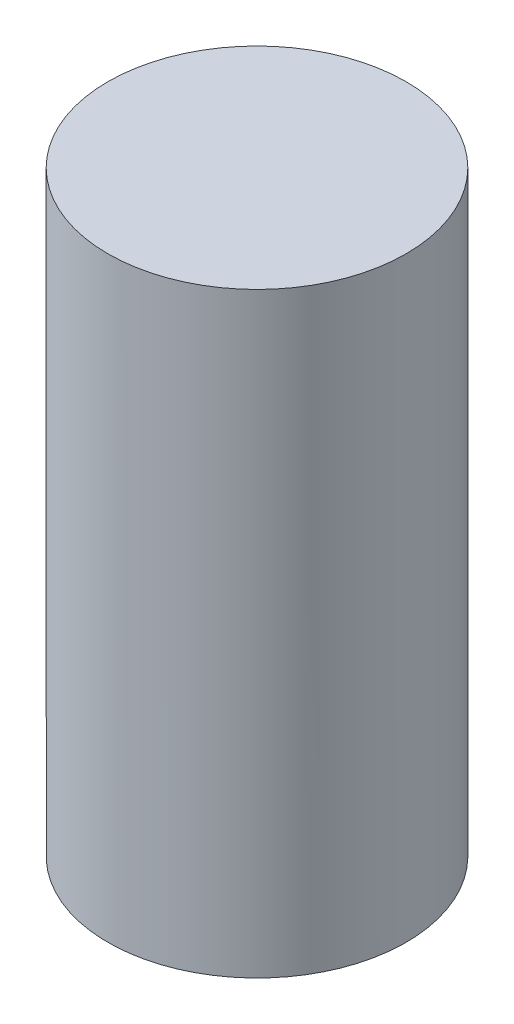
ISO-10303-21;
HEADER;
FILE_DESCRIPTION(('STEP AP214'),'2;1');
FILE_NAME('part.step','',(''),(''),'','','');
FILE_SCHEMA(('AUTOMOTIVE_DESIGN { 1 0 10303 214 1 1 1 1 }'));
ENDSEC;
DATA;
#1=APPLICATION_CONTEXT('core data for automotive mechanical design processes');
#2=APPLICATION_PROTOCOL_DEFINITION('international standard','automotive_design',2000,#1);
#3=PRODUCT_CONTEXT('',#1,'mechanical');
#4=PRODUCT('Part','Part','',(#3));
#5=PRODUCT_RELATED_PRODUCT_CATEGORY('part','',(#4));
#6=PRODUCT_DEFINITION_FORMATION('','',#4);
#7=PRODUCT_DEFINITION_CONTEXT('part definition',#1,'design');
#8=PRODUCT_DEFINITION('design','',#6,#7);
#9=PRODUCT_DEFINITION_SHAPE('','',#8);
#10=(LENGTH_UNIT() NAMED_UNIT(*) SI_UNIT(.MILLI.,.METRE.));
#11=(NAMED_UNIT(*) PLANE_ANGLE_UNIT() SI_UNIT($,.RADIAN.));
#12=(NAMED_UNIT(*) SI_UNIT($,.STERADIAN.) SOLID_ANGLE_UNIT());
#13=UNCERTAINTY_MEASURE_WITH_UNIT(LENGTH_MEASURE(1.E-05),#10,'distance_accuracy_value','');
#14=(GEOMETRIC_REPRESENTATION_CONTEXT(3) GLOBAL_UNCERTAINTY_ASSIGNED_CONTEXT((#13)) GLOBAL_UNIT_ASSIGNED_CONTEXT((#10,
#11,#12)) REPRESENTATION_CONTEXT('',''));
#15=CARTESIAN_POINT('',(0.,0.,0.));
#16=DIRECTION('',(0.,0.,1.));
#17=DIRECTION('',(1.,0.,0.));
#18=AXIS2_PLACEMENT_3D('',#15,#16,#17);
#19=CARTESIAN_POINT('',(0.,15.,0.));
#20=DIRECTION('',(0.,-1.,0.));
#21=DIRECTION('',(0.,0.,-1.));
#22=AXIS2_PLACEMENT_3D('',#19,#20,#21);
#23=CYLINDRICAL_SURFACE('',#22,5.);
#24=CARTESIAN_POINT('',(0.,-2.,0.));
#25=DIRECTION('',(0.,-1.,0.));
#26=DIRECTION('',(0.,0.,-1.));
#27=AXIS2_PLACEMENT_3D('',#24,#25,#26);
#28=CIRCLE('',#27,5.);
#29=CARTESIAN_POINT('',(0.,-2.,-5.));
#30=VERTEX_POINT('',#29);
#31=EDGE_CURVE('E195',#30,#30,#28,.T.);
#32=ORIENTED_EDGE('',*,*,#31,.F.);
#33=EDGE_LOOP('',(#32));
#34=FACE_BOUND('',#33,.T.);
#35=CARTESIAN_POINT('',(0.,18.,0.));
#36=DIRECTION('',(0.,1.,0.));
#37=DIRECTION('',(0.,0.,1.));
#38=AXIS2_PLACEMENT_3D('',#35,#36,#37);
#39=CIRCLE('',#38,5.);
#40=CARTESIAN_POINT('',(0.,18.,5.));
#41=VERTEX_POINT('',#40);
#42=EDGE_CURVE('E198',#41,#41,#39,.T.);
#43=ORIENTED_EDGE('',*,*,#42,.F.);
#44=EDGE_LOOP('',(#43));
#45=FACE_BOUND('',#44,.T.);
#46=ADVANCED_FACE('F44',(#34,#45),#23,.T.);
#47=CARTESIAN_POINT('',(2.,15.,-2.23606797749979));
#48=DIRECTION('',(0.,-1.,0.));
#49=DIRECTION('',(0.,0.,-1.));
#50=AXIS2_PLACEMENT_3D('',#47,#48,#49);
#51=CYLINDRICAL_SURFACE('',#50,0.5);
#52=CARTESIAN_POINT('',(2.,0.,-2.23606797749979));
#53=DIRECTION('',(0.,1.,0.));
#54=DIRECTION('',(0.,0.,1.));
#55=AXIS2_PLACEMENT_3D('',#52,#53,#54);
#56=CIRCLE('',#55,0.5);
#57=CARTESIAN_POINT('',(2.33333333333333,0.,-2.60874597374976));
#58=VERTEX_POINT('',#57);
#59=CARTESIAN_POINT('',(1.5,0.,-2.23606797749979));
#60=VERTEX_POINT('',#59);
#61=EDGE_CURVE('E129',#58,#60,#56,.T.);
#62=ORIENTED_EDGE('',*,*,#61,.F.);
#63=DIRECTION('',(0.,-1.,0.));
#64=VECTOR('',#63,1.);
#65=CARTESIAN_POINT('',(2.33333333333333,15.,-2.60874597374976));
#66=LINE('',#65,#64);
#67=CARTESIAN_POINT('',(2.33333333333333,15.,-2.60874597374976));
#68=VERTEX_POINT('',#67);
#69=EDGE_CURVE('E146',#68,#58,#66,.T.);
#70=ORIENTED_EDGE('',*,*,#69,.F.);
#71=CARTESIAN_POINT('',(2.,15.,-2.23606797749979));
#72=DIRECTION('',(0.,1.,0.));
#73=DIRECTION('',(0.,0.,1.));
#74=AXIS2_PLACEMENT_3D('',#71,#72,#73);
#75=CIRCLE('',#74,0.5);
#76=CARTESIAN_POINT('',(1.5,15.,-2.23606797749979));
#77=VERTEX_POINT('',#76);
#78=EDGE_CURVE('E135',#68,#77,#75,.T.);
#79=ORIENTED_EDGE('',*,*,#78,.T.);
#80=DIRECTION('',(0.,-1.,0.));
#81=VECTOR('',#80,1.);
#82=CARTESIAN_POINT('',(1.5,15.,-2.23606797749979));
#83=LINE('',#82,#81);
#84=EDGE_CURVE('E11',#77,#60,#83,.T.);
#85=ORIENTED_EDGE('',*,*,#84,.T.);
#86=EDGE_LOOP('',(#62,#70,#79,#85));
#87=FACE_BOUND('',#86,.T.);
#88=ADVANCED_FACE('F172',(#87),#51,.F.);
#89=CARTESIAN_POINT('',(1.5,15.,2.23606797749979));
#90=DIRECTION('',(1.,0.,0.));
#91=DIRECTION('',(0.,0.,-1.));
#92=AXIS2_PLACEMENT_3D('',#89,#90,#91);
#93=PLANE('',#92);
#94=DIRECTION('',(0.,0.,1.));
#95=VECTOR('',#94,1.);
#96=CARTESIAN_POINT('',(1.5,0.,2.23606797749979));
#97=LINE('',#96,#95);
#98=CARTESIAN_POINT('',(1.5,0.,2.23606797749979));
#99=VERTEX_POINT('',#98);
#100=EDGE_CURVE('E149',#60,#99,#97,.T.);
#101=ORIENTED_EDGE('',*,*,#100,.F.);
#102=ORIENTED_EDGE('',*,*,#84,.F.);
#103=DIRECTION('',(0.,0.,1.));
#104=VECTOR('',#103,1.);
#105=CARTESIAN_POINT('',(1.5,15.,2.23606797749979));
#106=LINE('',#105,#104);
#107=CARTESIAN_POINT('',(1.5,15.,2.23606797749979));
#108=VERTEX_POINT('',#107);
#109=EDGE_CURVE('E138',#77,#108,#106,.T.);
#110=ORIENTED_EDGE('',*,*,#109,.T.);
#111=DIRECTION('',(0.,-1.,0.));
#112=VECTOR('',#111,1.);
#113=CARTESIAN_POINT('',(1.5,15.,2.23606797749979));
#114=LINE('',#113,#112);
#115=EDGE_CURVE('E51',#108,#99,#114,.T.);
#116=ORIENTED_EDGE('',*,*,#115,.T.);
#117=EDGE_LOOP('',(#101,#102,#110,#116));
#118=FACE_BOUND('',#117,.T.);
#119=ADVANCED_FACE('F162',(#118),#93,.T.);
#120=CARTESIAN_POINT('',(2.,15.,2.23606797749979));
#121=DIRECTION('',(0.,-1.,0.));
#122=DIRECTION('',(0.,0.,-1.));
#123=AXIS2_PLACEMENT_3D('',#120,#121,#122);
#124=CYLINDRICAL_SURFACE('',#123,0.5);
#125=CARTESIAN_POINT('',(2.,0.,2.23606797749979));
#126=DIRECTION('',(0.,1.,0.));
#127=DIRECTION('',(0.,0.,-1.));
#128=AXIS2_PLACEMENT_3D('',#125,#126,#127);
#129=CIRCLE('',#128,0.5);
#130=CARTESIAN_POINT('',(2.33333333333333,0.,2.60874597374976));
#131=VERTEX_POINT('',#130);
#132=EDGE_CURVE('E152',#99,#131,#129,.T.);
#133=ORIENTED_EDGE('',*,*,#132,.F.);
#134=ORIENTED_EDGE('',*,*,#115,.F.);
#135=CARTESIAN_POINT('',(2.,15.,2.23606797749979));
#136=DIRECTION('',(0.,1.,0.));
#137=DIRECTION('',(0.,0.,-1.));
#138=AXIS2_PLACEMENT_3D('',#135,#136,#137);
#139=CIRCLE('',#138,0.5);
#140=CARTESIAN_POINT('',(2.33333333333333,15.,2.60874597374976));
#141=VERTEX_POINT('',#140);
#142=EDGE_CURVE('E142',#108,#141,#139,.T.);
#143=ORIENTED_EDGE('',*,*,#142,.T.);
#144=DIRECTION('',(0.,-1.,0.));
#145=VECTOR('',#144,1.);
#146=CARTESIAN_POINT('',(2.33333333333333,15.,2.60874597374976));
#147=LINE('',#146,#145);
#148=EDGE_CURVE('E158',#141,#131,#147,.T.);
#149=ORIENTED_EDGE('',*,*,#148,.T.);
#150=EDGE_LOOP('',(#133,#134,#143,#149));
#151=FACE_BOUND('',#150,.T.);
#152=ADVANCED_FACE('F165',(#151),#124,.F.);
#153=CARTESIAN_POINT('',(0.,15.,0.));
#154=DIRECTION('',(0.,-1.,0.));
#155=DIRECTION('',(0.,0.,-1.));
#156=AXIS2_PLACEMENT_3D('',#153,#154,#155);
#157=CYLINDRICAL_SURFACE('',#156,3.5);
#158=CARTESIAN_POINT('',(0.,0.,0.));
#159=DIRECTION('',(0.,1.,0.));
#160=DIRECTION('',(0.,0.,1.));
#161=AXIS2_PLACEMENT_3D('',#158,#159,#160);
#162=CIRCLE('',#161,3.5);
#163=EDGE_CURVE('E139',#131,#58,#162,.T.);
#164=ORIENTED_EDGE('',*,*,#163,.F.);
#165=ORIENTED_EDGE('',*,*,#148,.F.);
#166=CARTESIAN_POINT('',(0.,15.,0.));
#167=DIRECTION('',(0.,1.,0.));
#168=DIRECTION('',(0.,0.,1.));
#169=AXIS2_PLACEMENT_3D('',#166,#167,#168);
#170=CIRCLE('',#169,3.5);
#171=EDGE_CURVE('E66',#141,#68,#170,.T.);
#172=ORIENTED_EDGE('',*,*,#171,.T.);
#173=ORIENTED_EDGE('',*,*,#69,.T.);
#174=EDGE_LOOP('',(#164,#165,#172,#173));
#175=FACE_BOUND('',#174,.T.);
#176=ADVANCED_FACE('F175',(#175),#157,.F.);
#177=CARTESIAN_POINT('',(-2.,15.,2.23606797749979));
#178=DIRECTION('',(0.,-1.,0.));
#179=DIRECTION('',(0.,0.,-1.));
#180=AXIS2_PLACEMENT_3D('',#177,#178,#179);
#181=CYLINDRICAL_SURFACE('',#180,0.5);
#182=CARTESIAN_POINT('',(-2.,0.,2.23606797749979));
#183=DIRECTION('',(0.,1.,0.));
#184=DIRECTION('',(0.,0.,-1.));
#185=AXIS2_PLACEMENT_3D('',#182,#183,#184);
#186=CIRCLE('',#185,0.5);
#187=CARTESIAN_POINT('',(-2.33333333333333,0.,2.60874597374976));
#188=VERTEX_POINT('',#187);
#189=CARTESIAN_POINT('',(-1.5,0.,2.23606797749979));
#190=VERTEX_POINT('',#189);
#191=EDGE_CURVE('E215',#188,#190,#186,.T.);
#192=ORIENTED_EDGE('',*,*,#191,.F.);
#193=DIRECTION('',(0.,-1.,0.));
#194=VECTOR('',#193,1.);
#195=CARTESIAN_POINT('',(-2.33333333333333,15.,2.60874597374976));
#196=LINE('',#195,#194);
#197=CARTESIAN_POINT('',(-2.33333333333333,15.,2.60874597374976));
#198=VERTEX_POINT('',#197);
#199=EDGE_CURVE('E131',#198,#188,#196,.T.);
#200=ORIENTED_EDGE('',*,*,#199,.F.);
#201=CARTESIAN_POINT('',(-2.,15.,2.23606797749979));
#202=DIRECTION('',(0.,1.,0.));
#203=DIRECTION('',(0.,0.,-1.));
#204=AXIS2_PLACEMENT_3D('',#201,#202,#203);
#205=CIRCLE('',#204,0.5);
#206=CARTESIAN_POINT('',(-1.5,15.,2.23606797749979));
#207=VERTEX_POINT('',#206);
#208=EDGE_CURVE('E121',#198,#207,#205,.T.);
#209=ORIENTED_EDGE('',*,*,#208,.T.);
#210=DIRECTION('',(0.,-1.,0.));
#211=VECTOR('',#210,1.);
#212=CARTESIAN_POINT('',(-1.5,15.,2.23606797749979));
#213=LINE('',#212,#211);
#214=EDGE_CURVE('E120',#207,#190,#213,.T.);
#215=ORIENTED_EDGE('',*,*,#214,.T.);
#216=EDGE_LOOP('',(#192,#200,#209,#215));
#217=FACE_BOUND('',#216,.T.);
#218=ADVANCED_FACE('F177',(#217),#181,.F.);
#219=CARTESIAN_POINT('',(-1.5,15.,2.23606797749979));
#220=DIRECTION('',(-1.,0.,0.));
#221=DIRECTION('',(0.,0.,1.));
#222=AXIS2_PLACEMENT_3D('',#219,#220,#221);
#223=PLANE('',#222);
#224=DIRECTION('',(0.,0.,-1.));
#225=VECTOR('',#224,1.);
#226=CARTESIAN_POINT('',(-1.5,0.,2.23606797749979));
#227=LINE('',#226,#225);
#228=CARTESIAN_POINT('',(-1.5,0.,-2.23606797749979));
#229=VERTEX_POINT('',#228);
#230=EDGE_CURVE('E221',#190,#229,#227,.T.);
#231=ORIENTED_EDGE('',*,*,#230,.F.);
#232=ORIENTED_EDGE('',*,*,#214,.F.);
#233=DIRECTION('',(0.,0.,-1.));
#234=VECTOR('',#233,1.);
#235=CARTESIAN_POINT('',(-1.5,15.,2.23606797749979));
#236=LINE('',#235,#234);
#237=CARTESIAN_POINT('',(-1.5,15.,-2.23606797749979));
#238=VERTEX_POINT('',#237);
#239=EDGE_CURVE('E109',#207,#238,#236,.T.);
#240=ORIENTED_EDGE('',*,*,#239,.T.);
#241=DIRECTION('',(0.,-1.,0.));
#242=VECTOR('',#241,1.);
#243=CARTESIAN_POINT('',(-1.5,15.,-2.23606797749979));
#244=LINE('',#243,#242);
#245=EDGE_CURVE('E117',#238,#229,#244,.T.);
#246=ORIENTED_EDGE('',*,*,#245,.T.);
#247=EDGE_LOOP('',(#231,#232,#240,#246));
#248=FACE_BOUND('',#247,.T.);
#249=ADVANCED_FACE('F116',(#248),#223,.T.);
#250=CARTESIAN_POINT('',(-2.,15.,-2.23606797749979));
#251=DIRECTION('',(0.,-1.,0.));
#252=DIRECTION('',(0.,0.,-1.));
#253=AXIS2_PLACEMENT_3D('',#250,#251,#252);
#254=CYLINDRICAL_SURFACE('',#253,0.5);
#255=CARTESIAN_POINT('',(-2.,0.,-2.23606797749979));
#256=DIRECTION('',(0.,1.,0.));
#257=DIRECTION('',(0.,0.,1.));
#258=AXIS2_PLACEMENT_3D('',#255,#256,#257);
#259=CIRCLE('',#258,0.5);
#260=CARTESIAN_POINT('',(-2.33333333333333,0.,-2.60874597374976));
#261=VERTEX_POINT('',#260);
#262=EDGE_CURVE('E125',#229,#261,#259,.T.);
#263=ORIENTED_EDGE('',*,*,#262,.F.);
#264=ORIENTED_EDGE('',*,*,#245,.F.);
#265=CARTESIAN_POINT('',(-2.,15.,-2.23606797749979));
#266=DIRECTION('',(0.,1.,0.));
#267=DIRECTION('',(0.,0.,1.));
#268=AXIS2_PLACEMENT_3D('',#265,#266,#267);
#269=CIRCLE('',#268,0.5);
#270=CARTESIAN_POINT('',(-2.33333333333333,15.,-2.60874597374976));
#271=VERTEX_POINT('',#270);
#272=EDGE_CURVE('E106',#238,#271,#269,.T.);
#273=ORIENTED_EDGE('',*,*,#272,.T.);
#274=DIRECTION('',(0.,-1.,0.));
#275=VECTOR('',#274,1.);
#276=CARTESIAN_POINT('',(-2.33333333333333,15.,-2.60874597374976));
#277=LINE('',#276,#275);
#278=EDGE_CURVE('E127',#271,#261,#277,.T.);
#279=ORIENTED_EDGE('',*,*,#278,.T.);
#280=EDGE_LOOP('',(#263,#264,#273,#279));
#281=FACE_BOUND('',#280,.T.);
#282=ADVANCED_FACE('F123',(#281),#254,.F.);
#283=CARTESIAN_POINT('',(0.,15.,0.));
#284=DIRECTION('',(0.,-1.,0.));
#285=DIRECTION('',(0.,0.,-1.));
#286=AXIS2_PLACEMENT_3D('',#283,#284,#285);
#287=CYLINDRICAL_SURFACE('',#286,3.5);
#288=CARTESIAN_POINT('',(0.,0.,0.));
#289=DIRECTION('',(0.,1.,0.));
#290=DIRECTION('',(0.,0.,1.));
#291=AXIS2_PLACEMENT_3D('',#288,#289,#290);
#292=CIRCLE('',#291,3.5);
#293=EDGE_CURVE('E216',#261,#188,#292,.T.);
#294=ORIENTED_EDGE('',*,*,#293,.F.);
#295=ORIENTED_EDGE('',*,*,#278,.F.);
#296=CARTESIAN_POINT('',(0.,15.,0.));
#297=DIRECTION('',(0.,1.,0.));
#298=DIRECTION('',(0.,0.,1.));
#299=AXIS2_PLACEMENT_3D('',#296,#297,#298);
#300=CIRCLE('',#299,3.5);
#301=EDGE_CURVE('E58',#271,#198,#300,.T.);
#302=ORIENTED_EDGE('',*,*,#301,.T.);
#303=ORIENTED_EDGE('',*,*,#199,.T.);
#304=EDGE_LOOP('',(#294,#295,#302,#303));
#305=FACE_BOUND('',#304,.T.);
#306=ADVANCED_FACE('F229',(#305),#287,.F.);
#307=CARTESIAN_POINT('',(0.,0.,0.));
#308=DIRECTION('',(0.,-1.,0.));
#309=DIRECTION('',(0.,0.,-1.));
#310=AXIS2_PLACEMENT_3D('',#307,#308,#309);
#311=PLANE('',#310);
#312=CARTESIAN_POINT('',(2.5,0.,0.));
#313=DIRECTION('',(0.,-1.,0.));
#314=DIRECTION('',(0.,0.,1.));
#315=AXIS2_PLACEMENT_3D('',#312,#313,#314);
#316=CIRCLE('',#315,0.8);
#317=CARTESIAN_POINT('',(2.5,0.,0.8));
#318=VERTEX_POINT('',#317);
#319=EDGE_CURVE('E200',#318,#318,#316,.T.);
#320=ORIENTED_EDGE('',*,*,#319,.T.);
#321=EDGE_LOOP('',(#320));
#322=FACE_BOUND('',#321,.T.);
#323=ORIENTED_EDGE('',*,*,#163,.T.);
#324=ORIENTED_EDGE('',*,*,#61,.T.);
#325=ORIENTED_EDGE('',*,*,#100,.T.);
#326=ORIENTED_EDGE('',*,*,#132,.T.);
#327=EDGE_LOOP('',(#323,#324,#325,#326));
#328=FACE_BOUND('',#327,.T.);
#329=ADVANCED_FACE('F168',(#322,#328),#311,.F.);
#330=CARTESIAN_POINT('',(-2.5,0.,0.));
#331=DIRECTION('',(0.,-1.,0.));
#332=DIRECTION('',(0.,0.,-1.));
#333=AXIS2_PLACEMENT_3D('',#330,#331,#332);
#334=CIRCLE('',#333,0.8);
#335=CARTESIAN_POINT('',(-2.5,0.,-0.8));
#336=VERTEX_POINT('',#335);
#337=EDGE_CURVE('E207',#336,#336,#334,.T.);
#338=ORIENTED_EDGE('',*,*,#337,.T.);
#339=EDGE_LOOP('',(#338));
#340=FACE_BOUND('',#339,.T.);
#341=ORIENTED_EDGE('',*,*,#293,.T.);
#342=ORIENTED_EDGE('',*,*,#191,.T.);
#343=ORIENTED_EDGE('',*,*,#230,.T.);
#344=ORIENTED_EDGE('',*,*,#262,.T.);
#345=EDGE_LOOP('',(#341,#342,#343,#344));
#346=FACE_BOUND('',#345,.T.);
#347=ADVANCED_FACE('F231',(#340,#346),#311,.F.);
#348=CARTESIAN_POINT('',(0.,-2.,0.));
#349=DIRECTION('',(0.,-1.,0.));
#350=DIRECTION('',(0.,0.,-1.));
#351=AXIS2_PLACEMENT_3D('',#348,#349,#350);
#352=PLANE('',#351);
#353=CARTESIAN_POINT('',(-2.5,-2.,0.));
#354=DIRECTION('',(0.,-1.,0.));
#355=DIRECTION('',(0.,0.,-1.));
#356=AXIS2_PLACEMENT_3D('',#353,#354,#355);
#357=CIRCLE('',#356,0.8);
#358=CARTESIAN_POINT('',(-2.5,-2.,-0.8));
#359=VERTEX_POINT('',#358);
#360=EDGE_CURVE('E209',#359,#359,#357,.T.);
#361=ORIENTED_EDGE('',*,*,#360,.F.);
#362=EDGE_LOOP('',(#361));
#363=FACE_BOUND('',#362,.T.);
#364=ORIENTED_EDGE('',*,*,#31,.T.);
#365=EDGE_LOOP('',(#364));
#366=FACE_BOUND('',#365,.T.);
#367=CARTESIAN_POINT('',(2.5,-2.,0.));
#368=DIRECTION('',(0.,-1.,0.));
#369=DIRECTION('',(0.,0.,1.));
#370=AXIS2_PLACEMENT_3D('',#367,#368,#369);
#371=CIRCLE('',#370,0.8);
#372=CARTESIAN_POINT('',(2.5,-2.,0.8));
#373=VERTEX_POINT('',#372);
#374=EDGE_CURVE('E203',#373,#373,#371,.T.);
#375=ORIENTED_EDGE('',*,*,#374,.F.);
#376=EDGE_LOOP('',(#375));
#377=FACE_BOUND('',#376,.T.);
#378=ADVANCED_FACE('F233',(#363,#366,#377),#352,.T.);
#379=CARTESIAN_POINT('',(-2.5,-2.,0.));
#380=DIRECTION('',(0.,1.,0.));
#381=DIRECTION('',(0.,0.,1.));
#382=AXIS2_PLACEMENT_3D('',#379,#380,#381);
#383=CYLINDRICAL_SURFACE('',#382,0.8);
#384=ORIENTED_EDGE('',*,*,#360,.T.);
#385=EDGE_LOOP('',(#384));
#386=FACE_BOUND('',#385,.T.);
#387=ORIENTED_EDGE('',*,*,#337,.F.);
#388=EDGE_LOOP('',(#387));
#389=FACE_BOUND('',#388,.T.);
#390=ADVANCED_FACE('F240',(#386,#389),#383,.F.);
#391=CARTESIAN_POINT('',(2.5,-2.,0.));
#392=DIRECTION('',(0.,1.,0.));
#393=DIRECTION('',(0.,0.,1.));
#394=AXIS2_PLACEMENT_3D('',#391,#392,#393);
#395=CYLINDRICAL_SURFACE('',#394,0.8);
#396=ORIENTED_EDGE('',*,*,#374,.T.);
#397=EDGE_LOOP('',(#396));
#398=FACE_BOUND('',#397,.T.);
#399=ORIENTED_EDGE('',*,*,#319,.F.);
#400=EDGE_LOOP('',(#399));
#401=FACE_BOUND('',#400,.T.);
#402=ADVANCED_FACE('F273',(#398,#401),#395,.F.);
#403=CARTESIAN_POINT('',(0.,15.,0.));
#404=DIRECTION('',(0.,1.,0.));
#405=DIRECTION('',(0.,0.,1.));
#406=AXIS2_PLACEMENT_3D('',#403,#404,#405);
#407=PLANE('',#406);
#408=ORIENTED_EDGE('',*,*,#239,.F.);
#409=ORIENTED_EDGE('',*,*,#208,.F.);
#410=ORIENTED_EDGE('',*,*,#301,.F.);
#411=ORIENTED_EDGE('',*,*,#272,.F.);
#412=EDGE_LOOP('',(#408,#409,#410,#411));
#413=FACE_BOUND('',#412,.T.);
#414=ADVANCED_FACE('F108',(#413),#407,.F.);
#415=ORIENTED_EDGE('',*,*,#109,.F.);
#416=ORIENTED_EDGE('',*,*,#78,.F.);
#417=ORIENTED_EDGE('',*,*,#171,.F.);
#418=ORIENTED_EDGE('',*,*,#142,.F.);
#419=EDGE_LOOP('',(#415,#416,#417,#418));
#420=FACE_BOUND('',#419,.T.);
#421=ADVANCED_FACE('F173',(#420),#407,.F.);
#422=CARTESIAN_POINT('',(0.,18.,0.));
#423=DIRECTION('',(0.,1.,0.));
#424=DIRECTION('',(0.,0.,1.));
#425=AXIS2_PLACEMENT_3D('',#422,#423,#424);
#426=PLANE('',#425);
#427=ORIENTED_EDGE('',*,*,#42,.T.);
#428=EDGE_LOOP('',(#427));
#429=FACE_BOUND('',#428,.T.);
#430=ADVANCED_FACE('F281',(#429),#426,.T.);
#431=CLOSED_SHELL('',(#46,#88,#119,#152,#176,#218,#249,#282,#306,#329,#347,#378,#390,#402,#414,
#421,#430));
#432=MANIFOLD_SOLID_BREP('B2',#431);
#433=ADVANCED_BREP_SHAPE_REPRESENTATION('',(#18,#432),#14);
#434=SHAPE_DEFINITION_REPRESENTATION(#9,#433);
ENDSEC;
END-ISO-10303-21;
